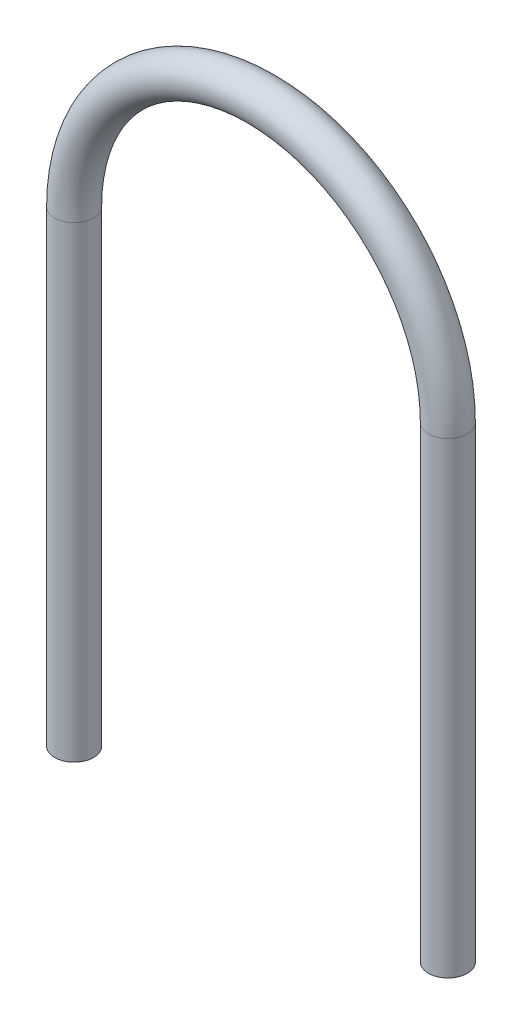
ISO-10303-21;
HEADER;
FILE_DESCRIPTION(('STEP AP214'),'2;1');
FILE_NAME('part.step','',(''),(''),'','','');
FILE_SCHEMA(('AUTOMOTIVE_DESIGN { 1 0 10303 214 1 1 1 1 }'));
ENDSEC;
DATA;
#1=APPLICATION_CONTEXT('core data for automotive mechanical design processes');
#2=APPLICATION_PROTOCOL_DEFINITION('international standard','automotive_design',2000,#1);
#3=PRODUCT_CONTEXT('',#1,'mechanical');
#4=PRODUCT('Part','Part','',(#3));
#5=PRODUCT_RELATED_PRODUCT_CATEGORY('part','',(#4));
#6=PRODUCT_DEFINITION_FORMATION('','',#4);
#7=PRODUCT_DEFINITION_CONTEXT('part definition',#1,'design');
#8=PRODUCT_DEFINITION('design','',#6,#7);
#9=PRODUCT_DEFINITION_SHAPE('','',#8);
#10=(LENGTH_UNIT() NAMED_UNIT(*) SI_UNIT(.MILLI.,.METRE.));
#11=(NAMED_UNIT(*) PLANE_ANGLE_UNIT() SI_UNIT($,.RADIAN.));
#12=(NAMED_UNIT(*) SI_UNIT($,.STERADIAN.) SOLID_ANGLE_UNIT());
#13=UNCERTAINTY_MEASURE_WITH_UNIT(LENGTH_MEASURE(1.E-05),#10,'distance_accuracy_value','');
#14=(GEOMETRIC_REPRESENTATION_CONTEXT(3) GLOBAL_UNCERTAINTY_ASSIGNED_CONTEXT((#13)) GLOBAL_UNIT_ASSIGNED_CONTEXT((#10,
#11,#12)) REPRESENTATION_CONTEXT('',''));
#15=CARTESIAN_POINT('',(0.,0.,0.));
#16=DIRECTION('',(0.,0.,1.));
#17=DIRECTION('',(1.,0.,0.));
#18=AXIS2_PLACEMENT_3D('',#15,#16,#17);
#19=CARTESIAN_POINT('',(-57.785,76.2,0.));
#20=DIRECTION('',(0.,-1.,0.));
#21=DIRECTION('',(1.,0.,0.));
#22=AXIS2_PLACEMENT_3D('',#19,#20,#21);
#23=CYLINDRICAL_SURFACE('',#22,3.175);
#24=CARTESIAN_POINT('',(-57.785,76.2,0.));
#25=DIRECTION('',(0.,-1.,0.));
#26=DIRECTION('',(0.,0.,1.));
#27=AXIS2_PLACEMENT_3D('',#24,#25,#26);
#28=CIRCLE('',#27,3.175);
#29=CARTESIAN_POINT('',(-60.96,76.2,0.));
#30=VERTEX_POINT('',#29);
#31=EDGE_CURVE('E38',#30,#30,#28,.T.);
#32=ORIENTED_EDGE('',*,*,#31,.T.);
#33=EDGE_LOOP('',(#32));
#34=FACE_BOUND('',#33,.T.);
#35=CARTESIAN_POINT('',(-57.785,0.,0.));
#36=DIRECTION('',(0.,-1.,0.));
#37=DIRECTION('',(0.,0.,1.));
#38=AXIS2_PLACEMENT_3D('',#35,#36,#37);
#39=CIRCLE('',#38,3.175);
#40=CARTESIAN_POINT('',(-57.785,0.,3.175));
#41=VERTEX_POINT('',#40);
#42=EDGE_CURVE('E10',#41,#41,#39,.T.);
#43=ORIENTED_EDGE('',*,*,#42,.F.);
#44=EDGE_LOOP('',(#43));
#45=FACE_BOUND('',#44,.T.);
#46=ADVANCED_FACE('F32',(#34,#45),#23,.T.);
#47=CARTESIAN_POINT('',(-27.305,76.2,0.));
#48=DIRECTION('',(0.,0.,1.));
#49=DIRECTION('',(1.,0.,0.));
#50=AXIS2_PLACEMENT_3D('',#47,#48,#49);
#51=TOROIDAL_SURFACE('',#50,30.48,3.175);
#52=CARTESIAN_POINT('',(3.175,76.2,0.));
#53=DIRECTION('',(0.,1.,0.));
#54=DIRECTION('',(0.,0.,1.));
#55=AXIS2_PLACEMENT_3D('',#52,#53,#54);
#56=CIRCLE('',#55,3.175);
#57=CARTESIAN_POINT('',(6.35,76.2,0.));
#58=VERTEX_POINT('',#57);
#59=EDGE_CURVE('E42',#58,#58,#56,.T.);
#60=CARTESIAN_POINT('',(-27.305,76.2,0.));
#61=DIRECTION('',(0.,0.,1.));
#62=DIRECTION('',(1.,0.,0.));
#63=AXIS2_PLACEMENT_3D('',#60,#61,#62);
#64=CIRCLE('',#63,33.655);
#65=EDGE_CURVE('',#58,#30,#64,.T.);
#66=ORIENTED_EDGE('',*,*,#59,.T.);
#67=ORIENTED_EDGE('',*,*,#31,.F.);
#68=ORIENTED_EDGE('',*,*,#65,.T.);
#69=ORIENTED_EDGE('',*,*,#65,.F.);
#70=EDGE_LOOP('',(#66,#68,#67,#69));
#71=FACE_BOUND('',#70,.T.);
#72=ADVANCED_FACE('F64',(#71),#51,.T.);
#73=CARTESIAN_POINT('',(3.175,76.2,0.));
#74=DIRECTION('',(0.,-1.,0.));
#75=DIRECTION('',(0.,0.,-1.));
#76=AXIS2_PLACEMENT_3D('',#73,#74,#75);
#77=CYLINDRICAL_SURFACE('',#76,3.175);
#78=ORIENTED_EDGE('',*,*,#59,.F.);
#79=EDGE_LOOP('',(#78));
#80=FACE_BOUND('',#79,.T.);
#81=CARTESIAN_POINT('',(3.175,0.,0.));
#82=DIRECTION('',(0.,1.,0.));
#83=DIRECTION('',(0.,0.,1.));
#84=AXIS2_PLACEMENT_3D('',#81,#82,#83);
#85=CIRCLE('',#84,3.175);
#86=CARTESIAN_POINT('',(3.175,0.,3.175));
#87=VERTEX_POINT('',#86);
#88=EDGE_CURVE('E46',#87,#87,#85,.T.);
#89=ORIENTED_EDGE('',*,*,#88,.T.);
#90=EDGE_LOOP('',(#89));
#91=FACE_BOUND('',#90,.T.);
#92=ADVANCED_FACE('F52',(#80,#91),#77,.T.);
#93=CARTESIAN_POINT('',(-57.785,0.,0.));
#94=DIRECTION('',(0.,-1.,0.));
#95=DIRECTION('',(0.,0.,1.));
#96=AXIS2_PLACEMENT_3D('',#93,#94,#95);
#97=PLANE('',#96);
#98=ORIENTED_EDGE('',*,*,#42,.T.);
#99=EDGE_LOOP('',(#98));
#100=FACE_BOUND('',#99,.T.);
#101=ADVANCED_FACE('F56',(#100),#97,.T.);
#102=CARTESIAN_POINT('',(3.175,0.,0.));
#103=DIRECTION('',(0.,1.,0.));
#104=DIRECTION('',(0.,0.,1.));
#105=AXIS2_PLACEMENT_3D('',#102,#103,#104);
#106=PLANE('',#105);
#107=ORIENTED_EDGE('',*,*,#88,.F.);
#108=EDGE_LOOP('',(#107));
#109=FACE_BOUND('',#108,.T.);
#110=ADVANCED_FACE('F54',(#109),#106,.F.);
#111=CLOSED_SHELL('',(#46,#72,#92,#101,#110));
#112=MANIFOLD_SOLID_BREP('B2',#111);
#113=ADVANCED_BREP_SHAPE_REPRESENTATION('',(#18,#112),#14);
#114=SHAPE_DEFINITION_REPRESENTATION(#9,#113);
ENDSEC;
END-ISO-10303-21;
